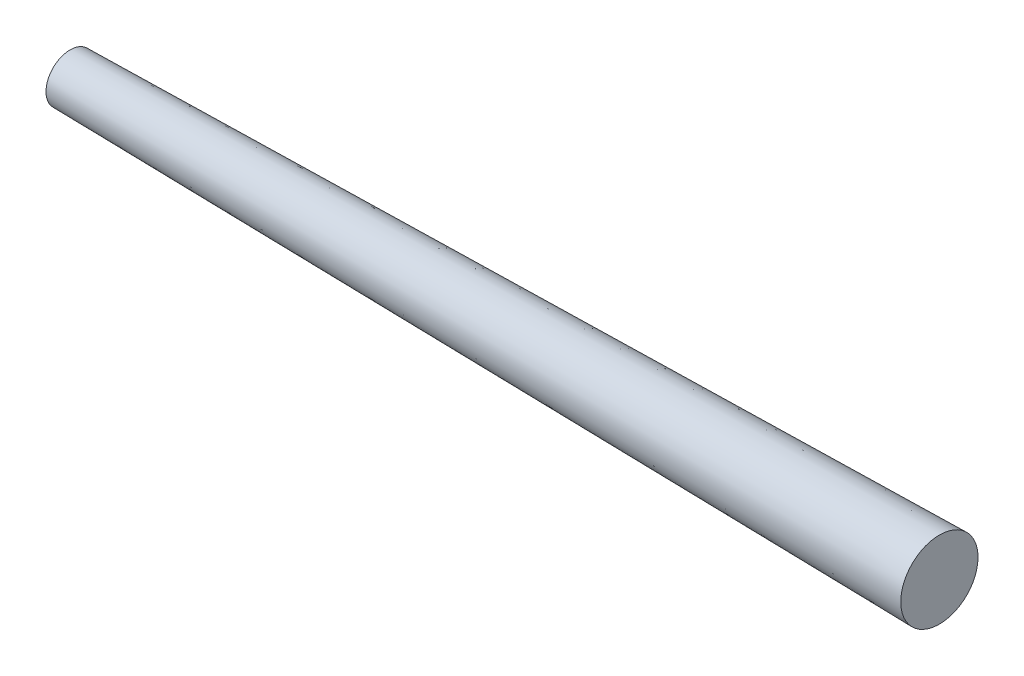
ISO-10303-21;
HEADER;
FILE_DESCRIPTION(('STEP AP214'),'2;1');
FILE_NAME('part.step','',(''),(''),'','','');
FILE_SCHEMA(('AUTOMOTIVE_DESIGN { 1 0 10303 214 1 1 1 1 }'));
ENDSEC;
DATA;
#1=APPLICATION_CONTEXT('core data for automotive mechanical design processes');
#2=APPLICATION_PROTOCOL_DEFINITION('international standard','automotive_design',2000,#1);
#3=PRODUCT_CONTEXT('',#1,'mechanical');
#4=PRODUCT('Part','Part','',(#3));
#5=PRODUCT_RELATED_PRODUCT_CATEGORY('part','',(#4));
#6=PRODUCT_DEFINITION_FORMATION('','',#4);
#7=PRODUCT_DEFINITION_CONTEXT('part definition',#1,'design');
#8=PRODUCT_DEFINITION('design','',#6,#7);
#9=PRODUCT_DEFINITION_SHAPE('','',#8);
#10=(LENGTH_UNIT() NAMED_UNIT(*) SI_UNIT(.MILLI.,.METRE.));
#11=(NAMED_UNIT(*) PLANE_ANGLE_UNIT() SI_UNIT($,.RADIAN.));
#12=(NAMED_UNIT(*) SI_UNIT($,.STERADIAN.) SOLID_ANGLE_UNIT());
#13=UNCERTAINTY_MEASURE_WITH_UNIT(LENGTH_MEASURE(1.E-05),#10,'distance_accuracy_value','');
#14=(GEOMETRIC_REPRESENTATION_CONTEXT(3) GLOBAL_UNCERTAINTY_ASSIGNED_CONTEXT((#13)) GLOBAL_UNIT_ASSIGNED_CONTEXT((#10,
#11,#12)) REPRESENTATION_CONTEXT('',''));
#15=CARTESIAN_POINT('',(0.,0.,0.));
#16=DIRECTION('',(0.,0.,1.));
#17=DIRECTION('',(1.,0.,0.));
#18=AXIS2_PLACEMENT_3D('',#15,#16,#17);
#19=CARTESIAN_POINT('',(-10.5382343550447,0.,0.));
#20=DIRECTION('',(-1.,0.,0.));
#21=DIRECTION('',(0.,-1.,0.));
#22=AXIS2_PLACEMENT_3D('',#19,#20,#21);
#23=PLANE('',#22);
#24=CARTESIAN_POINT('',(-10.5382343550447,0.,0.));
#25=DIRECTION('',(1.,0.,0.));
#26=DIRECTION('',(0.,1.,0.));
#27=AXIS2_PLACEMENT_3D('',#24,#25,#26);
#28=CIRCLE('',#27,2.5);
#29=CARTESIAN_POINT('',(-10.5382343550447,2.5,0.));
#30=VERTEX_POINT('',#29);
#31=EDGE_CURVE('E10',#30,#30,#28,.T.);
#32=ORIENTED_EDGE('',*,*,#31,.F.);
#33=EDGE_LOOP('',(#32));
#34=FACE_BOUND('',#33,.T.);
#35=ADVANCED_FACE('F37',(#34),#23,.T.);
#36=CARTESIAN_POINT('',(79.4617656449553,0.,0.));
#37=DIRECTION('',(1.,0.,0.));
#38=DIRECTION('',(0.,1.,0.));
#39=AXIS2_PLACEMENT_3D('',#36,#37,#38);
#40=CONICAL_SURFACE('',#39,4.,0.0166651237139408);
#41=ORIENTED_EDGE('',*,*,#31,.T.);
#42=EDGE_LOOP('',(#41));
#43=FACE_BOUND('',#42,.T.);
#44=CARTESIAN_POINT('',(79.4617656449553,0.,0.));
#45=DIRECTION('',(1.,0.,0.));
#46=DIRECTION('',(0.,1.,0.));
#47=AXIS2_PLACEMENT_3D('',#44,#45,#46);
#48=CIRCLE('',#47,4.);
#49=CARTESIAN_POINT('',(79.4617656449553,4.00000000000001,0.));
#50=VERTEX_POINT('',#49);
#51=EDGE_CURVE('E43',#50,#50,#48,.T.);
#52=ORIENTED_EDGE('',*,*,#51,.F.);
#53=EDGE_LOOP('',(#52));
#54=FACE_BOUND('',#53,.T.);
#55=ADVANCED_FACE('F51',(#43,#54),#40,.T.);
#56=CARTESIAN_POINT('',(79.4617656449553,4.00000000000001,0.));
#57=DIRECTION('',(1.,0.,0.));
#58=DIRECTION('',(0.,1.,0.));
#59=AXIS2_PLACEMENT_3D('',#56,#57,#58);
#60=PLANE('',#59);
#61=ORIENTED_EDGE('',*,*,#51,.T.);
#62=EDGE_LOOP('',(#61));
#63=FACE_BOUND('',#62,.T.);
#64=ADVANCED_FACE('F49',(#63),#60,.T.);
#65=CLOSED_SHELL('',(#35,#55,#64));
#66=MANIFOLD_SOLID_BREP('B2',#65);
#67=ADVANCED_BREP_SHAPE_REPRESENTATION('',(#18,#66),#14);
#68=SHAPE_DEFINITION_REPRESENTATION(#9,#67);
ENDSEC;
END-ISO-10303-21;
